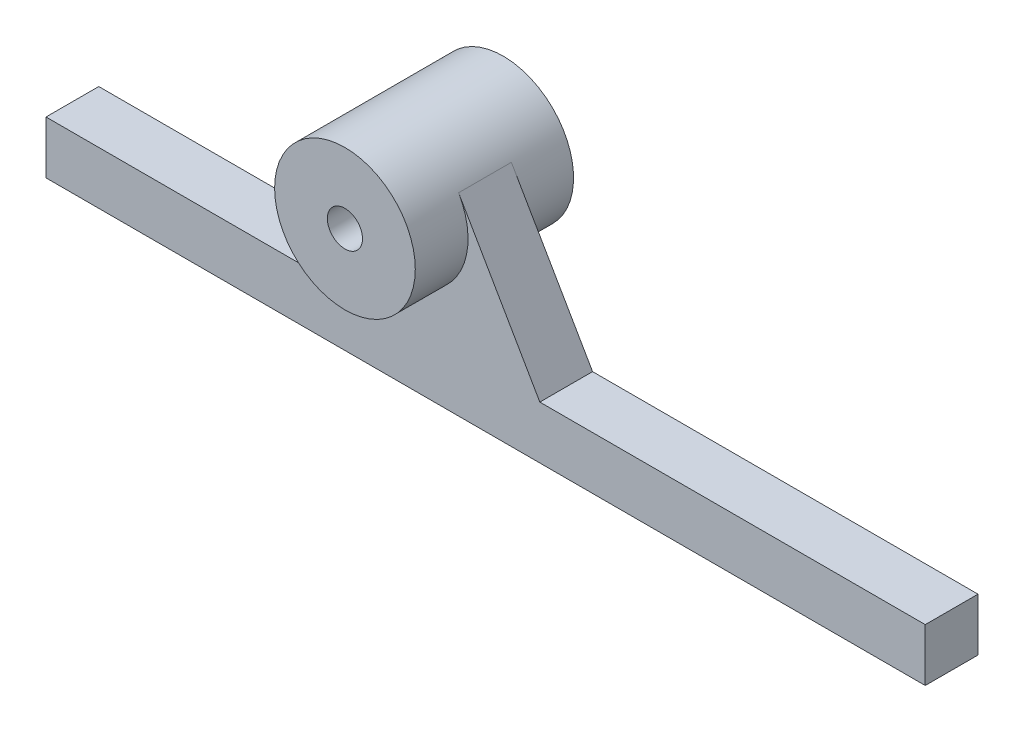
ISO-10303-21;
HEADER;
FILE_DESCRIPTION(('STEP AP214'),'2;1');
FILE_NAME('part.step','',(''),(''),'','','');
FILE_SCHEMA(('AUTOMOTIVE_DESIGN { 1 0 10303 214 1 1 1 1 }'));
ENDSEC;
DATA;
#1=APPLICATION_CONTEXT('core data for automotive mechanical design processes');
#2=APPLICATION_PROTOCOL_DEFINITION('international standard','automotive_design',2000,#1);
#3=PRODUCT_CONTEXT('',#1,'mechanical');
#4=PRODUCT('Part','Part','',(#3));
#5=PRODUCT_RELATED_PRODUCT_CATEGORY('part','',(#4));
#6=PRODUCT_DEFINITION_FORMATION('','',#4);
#7=PRODUCT_DEFINITION_CONTEXT('part definition',#1,'design');
#8=PRODUCT_DEFINITION('design','',#6,#7);
#9=PRODUCT_DEFINITION_SHAPE('','',#8);
#10=(LENGTH_UNIT() NAMED_UNIT(*) SI_UNIT(.MILLI.,.METRE.));
#11=(NAMED_UNIT(*) PLANE_ANGLE_UNIT() SI_UNIT($,.RADIAN.));
#12=(NAMED_UNIT(*) SI_UNIT($,.STERADIAN.) SOLID_ANGLE_UNIT());
#13=UNCERTAINTY_MEASURE_WITH_UNIT(LENGTH_MEASURE(1.E-05),#10,'distance_accuracy_value','');
#14=(GEOMETRIC_REPRESENTATION_CONTEXT(3) GLOBAL_UNCERTAINTY_ASSIGNED_CONTEXT((#13)) GLOBAL_UNIT_ASSIGNED_CONTEXT((#10,
#11,#12)) REPRESENTATION_CONTEXT('',''));
#15=CARTESIAN_POINT('',(0.,0.,0.));
#16=DIRECTION('',(0.,0.,1.));
#17=DIRECTION('',(1.,0.,0.));
#18=AXIS2_PLACEMENT_3D('',#15,#16,#17);
#19=CARTESIAN_POINT('',(0.,45.,15.));
#20=DIRECTION('',(0.,0.,1.));
#21=DIRECTION('',(1.,0.,0.));
#22=AXIS2_PLACEMENT_3D('',#19,#20,#21);
#23=PLANE('',#22);
#24=CARTESIAN_POINT('',(0.,45.,15.));
#25=DIRECTION('',(0.,0.,1.));
#26=DIRECTION('',(1.,0.,0.));
#27=AXIS2_PLACEMENT_3D('',#24,#25,#26);
#28=CIRCLE('',#27,20.);
#29=CARTESIAN_POINT('',(-19.6961550602442,48.4729635533385,15.));
#30=VERTEX_POINT('',#29);
#31=CARTESIAN_POINT('',(17.3205080756887,55.0000000000001,15.));
#32=VERTEX_POINT('',#31);
#33=EDGE_CURVE('E43',#30,#32,#28,.T.);
#34=ORIENTED_EDGE('',*,*,#33,.F.);
#35=DIRECTION('',(-0.173648177666927,-0.984807753012209,0.));
#36=VECTOR('',#35,1.);
#37=CARTESIAN_POINT('',(-19.6961550602442,48.4729635533385,15.));
#38=LINE('',#37,#36);
#39=CARTESIAN_POINT('',(-25.5983416589687,15.,15.));
#40=VERTEX_POINT('',#39);
#41=EDGE_CURVE('E109',#30,#40,#38,.T.);
#42=ORIENTED_EDGE('',*,*,#41,.T.);
#43=DIRECTION('',(-1.,0.,0.));
#44=VECTOR('',#43,1.);
#45=CARTESIAN_POINT('',(-25.5983416589687,15.,15.));
#46=LINE('',#45,#44);
#47=CARTESIAN_POINT('',(-100.,15.,15.));
#48=VERTEX_POINT('',#47);
#49=EDGE_CURVE('E52',#40,#48,#46,.T.);
#50=ORIENTED_EDGE('',*,*,#49,.T.);
#51=DIRECTION('',(0.,-1.,0.));
#52=VECTOR('',#51,1.);
#53=CARTESIAN_POINT('',(-100.,15.,15.));
#54=LINE('',#53,#52);
#55=CARTESIAN_POINT('',(-100.,0.,15.));
#56=VERTEX_POINT('',#55);
#57=EDGE_CURVE('E145',#48,#56,#54,.T.);
#58=ORIENTED_EDGE('',*,*,#57,.T.);
#59=DIRECTION('',(1.,0.,0.));
#60=VECTOR('',#59,1.);
#61=CARTESIAN_POINT('',(-100.,0.,15.));
#62=LINE('',#61,#60);
#63=CARTESIAN_POINT('',(150.,0.,15.));
#64=VERTEX_POINT('',#63);
#65=EDGE_CURVE('E94',#56,#64,#62,.T.);
#66=ORIENTED_EDGE('',*,*,#65,.T.);
#67=DIRECTION('',(0.,1.,0.));
#68=VECTOR('',#67,1.);
#69=CARTESIAN_POINT('',(150.,0.,15.));
#70=LINE('',#69,#68);
#71=CARTESIAN_POINT('',(150.,15.,15.));
#72=VERTEX_POINT('',#71);
#73=EDGE_CURVE('E174',#64,#72,#70,.T.);
#74=ORIENTED_EDGE('',*,*,#73,.T.);
#75=DIRECTION('',(-1.,0.,0.));
#76=VECTOR('',#75,1.);
#77=CARTESIAN_POINT('',(150.,15.,15.));
#78=LINE('',#77,#76);
#79=CARTESIAN_POINT('',(40.4145188432741,15.,15.));
#80=VERTEX_POINT('',#79);
#81=EDGE_CURVE('E126',#72,#80,#78,.T.);
#82=ORIENTED_EDGE('',*,*,#81,.T.);
#83=DIRECTION('',(-0.500000000000004,0.866025403784436,0.));
#84=VECTOR('',#83,1.);
#85=CARTESIAN_POINT('',(17.3205080756887,55.0000000000001,15.));
#86=LINE('',#85,#84);
#87=EDGE_CURVE('E111',#80,#32,#86,.T.);
#88=ORIENTED_EDGE('',*,*,#87,.T.);
#89=EDGE_LOOP('',(#34,#42,#50,#58,#66,#74,#82,#88));
#90=FACE_BOUND('',#89,.T.);
#91=ADVANCED_FACE('F33',(#90),#23,.T.);
#92=CARTESIAN_POINT('',(0.,45.,0.));
#93=DIRECTION('',(0.,0.,1.));
#94=DIRECTION('',(1.,0.,0.));
#95=AXIS2_PLACEMENT_3D('',#92,#93,#94);
#96=PLANE('',#95);
#97=CARTESIAN_POINT('',(0.,45.,0.));
#98=DIRECTION('',(0.,0.,-1.));
#99=DIRECTION('',(-1.,0.,0.));
#100=AXIS2_PLACEMENT_3D('',#97,#98,#99);
#101=CIRCLE('',#100,20.);
#102=CARTESIAN_POINT('',(17.3205080756887,55.0000000000001,0.));
#103=VERTEX_POINT('',#102);
#104=CARTESIAN_POINT('',(-19.6961550602442,48.4729635533385,0.));
#105=VERTEX_POINT('',#104);
#106=EDGE_CURVE('E11',#103,#105,#101,.T.);
#107=ORIENTED_EDGE('',*,*,#106,.F.);
#108=DIRECTION('',(-0.500000000000004,0.866025403784436,0.));
#109=VECTOR('',#108,1.);
#110=CARTESIAN_POINT('',(17.3205080756887,55.0000000000001,0.));
#111=LINE('',#110,#109);
#112=CARTESIAN_POINT('',(40.4145188432741,15.,0.));
#113=VERTEX_POINT('',#112);
#114=EDGE_CURVE('E140',#113,#103,#111,.T.);
#115=ORIENTED_EDGE('',*,*,#114,.F.);
#116=DIRECTION('',(-1.,0.,0.));
#117=VECTOR('',#116,1.);
#118=CARTESIAN_POINT('',(150.,15.,0.));
#119=LINE('',#118,#117);
#120=CARTESIAN_POINT('',(150.,15.,0.));
#121=VERTEX_POINT('',#120);
#122=EDGE_CURVE('E138',#121,#113,#119,.T.);
#123=ORIENTED_EDGE('',*,*,#122,.F.);
#124=DIRECTION('',(0.,1.,0.));
#125=VECTOR('',#124,1.);
#126=CARTESIAN_POINT('',(150.,0.,0.));
#127=LINE('',#126,#125);
#128=CARTESIAN_POINT('',(150.,0.,0.));
#129=VERTEX_POINT('',#128);
#130=EDGE_CURVE('E136',#129,#121,#127,.T.);
#131=ORIENTED_EDGE('',*,*,#130,.F.);
#132=DIRECTION('',(1.,0.,0.));
#133=VECTOR('',#132,1.);
#134=CARTESIAN_POINT('',(-100.,0.,0.));
#135=LINE('',#134,#133);
#136=CARTESIAN_POINT('',(-100.,0.,0.));
#137=VERTEX_POINT('',#136);
#138=EDGE_CURVE('E133',#137,#129,#135,.T.);
#139=ORIENTED_EDGE('',*,*,#138,.F.);
#140=DIRECTION('',(0.,-1.,0.));
#141=VECTOR('',#140,1.);
#142=CARTESIAN_POINT('',(-100.,15.,0.));
#143=LINE('',#142,#141);
#144=CARTESIAN_POINT('',(-100.,15.,0.));
#145=VERTEX_POINT('',#144);
#146=EDGE_CURVE('E130',#145,#137,#143,.T.);
#147=ORIENTED_EDGE('',*,*,#146,.F.);
#148=DIRECTION('',(-1.,0.,0.));
#149=VECTOR('',#148,1.);
#150=CARTESIAN_POINT('',(-25.5983416589687,15.,0.));
#151=LINE('',#150,#149);
#152=CARTESIAN_POINT('',(-25.5983416589687,15.,0.));
#153=VERTEX_POINT('',#152);
#154=EDGE_CURVE('E85',#153,#145,#151,.T.);
#155=ORIENTED_EDGE('',*,*,#154,.F.);
#156=DIRECTION('',(-0.173648177666927,-0.984807753012209,0.));
#157=VECTOR('',#156,1.);
#158=CARTESIAN_POINT('',(-19.6961550602442,48.4729635533385,0.));
#159=LINE('',#158,#157);
#160=EDGE_CURVE('E79',#105,#153,#159,.T.);
#161=ORIENTED_EDGE('',*,*,#160,.F.);
#162=EDGE_LOOP('',(#107,#115,#123,#131,#139,#147,#155,#161));
#163=FACE_BOUND('',#162,.T.);
#164=ADVANCED_FACE('F165',(#163),#96,.F.);
#165=CARTESIAN_POINT('',(-100.,15.,15.));
#166=DIRECTION('',(1.,0.,0.));
#167=DIRECTION('',(0.,0.,-1.));
#168=AXIS2_PLACEMENT_3D('',#165,#166,#167);
#169=PLANE('',#168);
#170=ORIENTED_EDGE('',*,*,#146,.T.);
#171=DIRECTION('',(0.,0.,-1.));
#172=VECTOR('',#171,1.);
#173=CARTESIAN_POINT('',(-100.,0.,15.));
#174=LINE('',#173,#172);
#175=EDGE_CURVE('E37',#56,#137,#174,.T.);
#176=ORIENTED_EDGE('',*,*,#175,.F.);
#177=ORIENTED_EDGE('',*,*,#57,.F.);
#178=DIRECTION('',(0.,0.,-1.));
#179=VECTOR('',#178,1.);
#180=CARTESIAN_POINT('',(-100.,15.,15.));
#181=LINE('',#180,#179);
#182=EDGE_CURVE('E124',#48,#145,#181,.T.);
#183=ORIENTED_EDGE('',*,*,#182,.T.);
#184=EDGE_LOOP('',(#170,#176,#177,#183));
#185=FACE_BOUND('',#184,.T.);
#186=ADVANCED_FACE('F35',(#185),#169,.F.);
#187=CARTESIAN_POINT('',(-100.,0.,15.));
#188=DIRECTION('',(0.,1.,0.));
#189=DIRECTION('',(0.,0.,1.));
#190=AXIS2_PLACEMENT_3D('',#187,#188,#189);
#191=PLANE('',#190);
#192=ORIENTED_EDGE('',*,*,#138,.T.);
#193=DIRECTION('',(0.,0.,-1.));
#194=VECTOR('',#193,1.);
#195=CARTESIAN_POINT('',(150.,0.,15.));
#196=LINE('',#195,#194);
#197=EDGE_CURVE('E154',#64,#129,#196,.T.);
#198=ORIENTED_EDGE('',*,*,#197,.F.);
#199=ORIENTED_EDGE('',*,*,#65,.F.);
#200=ORIENTED_EDGE('',*,*,#175,.T.);
#201=EDGE_LOOP('',(#192,#198,#199,#200));
#202=FACE_BOUND('',#201,.T.);
#203=ADVANCED_FACE('F160',(#202),#191,.F.);
#204=CARTESIAN_POINT('',(150.,0.,15.));
#205=DIRECTION('',(-1.,0.,0.));
#206=DIRECTION('',(0.,0.,1.));
#207=AXIS2_PLACEMENT_3D('',#204,#205,#206);
#208=PLANE('',#207);
#209=ORIENTED_EDGE('',*,*,#130,.T.);
#210=DIRECTION('',(0.,0.,-1.));
#211=VECTOR('',#210,1.);
#212=CARTESIAN_POINT('',(150.,15.,15.));
#213=LINE('',#212,#211);
#214=EDGE_CURVE('E152',#72,#121,#213,.T.);
#215=ORIENTED_EDGE('',*,*,#214,.F.);
#216=ORIENTED_EDGE('',*,*,#73,.F.);
#217=ORIENTED_EDGE('',*,*,#197,.T.);
#218=EDGE_LOOP('',(#209,#215,#216,#217));
#219=FACE_BOUND('',#218,.T.);
#220=ADVANCED_FACE('F169',(#219),#208,.F.);
#221=CARTESIAN_POINT('',(150.,15.,15.));
#222=DIRECTION('',(0.,-1.,0.));
#223=DIRECTION('',(1.,0.,0.));
#224=AXIS2_PLACEMENT_3D('',#221,#222,#223);
#225=PLANE('',#224);
#226=ORIENTED_EDGE('',*,*,#122,.T.);
#227=DIRECTION('',(0.,0.,-1.));
#228=VECTOR('',#227,1.);
#229=CARTESIAN_POINT('',(40.4145188432741,15.,15.));
#230=LINE('',#229,#228);
#231=EDGE_CURVE('E149',#80,#113,#230,.T.);
#232=ORIENTED_EDGE('',*,*,#231,.F.);
#233=ORIENTED_EDGE('',*,*,#81,.F.);
#234=ORIENTED_EDGE('',*,*,#214,.T.);
#235=EDGE_LOOP('',(#226,#232,#233,#234));
#236=FACE_BOUND('',#235,.T.);
#237=ADVANCED_FACE('F172',(#236),#225,.F.);
#238=CARTESIAN_POINT('',(17.3205080756887,55.0000000000001,15.));
#239=DIRECTION('',(-0.866025403784436,-0.500000000000004,0.));
#240=DIRECTION('',(0.500000000000004,-0.866025403784436,0.));
#241=AXIS2_PLACEMENT_3D('',#238,#239,#240);
#242=PLANE('',#241);
#243=ORIENTED_EDGE('',*,*,#114,.T.);
#244=DIRECTION('',(0.,0.,-1.));
#245=VECTOR('',#244,1.);
#246=CARTESIAN_POINT('',(17.3205080756887,55.0000000000001,15.));
#247=LINE('',#246,#245);
#248=EDGE_CURVE('E119',#32,#103,#247,.T.);
#249=ORIENTED_EDGE('',*,*,#248,.F.);
#250=ORIENTED_EDGE('',*,*,#87,.F.);
#251=ORIENTED_EDGE('',*,*,#231,.T.);
#252=EDGE_LOOP('',(#243,#249,#250,#251));
#253=FACE_BOUND('',#252,.T.);
#254=ADVANCED_FACE('F218',(#253),#242,.F.);
#255=CARTESIAN_POINT('',(0.,45.,15.));
#256=DIRECTION('',(0.,0.,-1.));
#257=DIRECTION('',(-1.,0.,0.));
#258=AXIS2_PLACEMENT_3D('',#255,#256,#257);
#259=CYLINDRICAL_SURFACE('',#258,20.);
#260=ORIENTED_EDGE('',*,*,#248,.T.);
#261=ORIENTED_EDGE('',*,*,#106,.T.);
#262=DIRECTION('',(0.,0.,-1.));
#263=VECTOR('',#262,1.);
#264=CARTESIAN_POINT('',(-19.6961550602442,48.4729635533385,15.));
#265=LINE('',#264,#263);
#266=EDGE_CURVE('E115',#30,#105,#265,.T.);
#267=ORIENTED_EDGE('',*,*,#266,.F.);
#268=ORIENTED_EDGE('',*,*,#33,.T.);
#269=EDGE_LOOP('',(#260,#261,#267,#268));
#270=FACE_BOUND('',#269,.T.);
#271=CARTESIAN_POINT('',(0.,45.,30.));
#272=DIRECTION('',(0.,0.,1.));
#273=DIRECTION('',(1.,0.,0.));
#274=AXIS2_PLACEMENT_3D('',#271,#272,#273);
#275=CIRCLE('',#274,20.);
#276=CARTESIAN_POINT('',(20.,45.,30.));
#277=VERTEX_POINT('',#276);
#278=EDGE_CURVE('E134',#277,#277,#275,.T.);
#279=ORIENTED_EDGE('',*,*,#278,.F.);
#280=EDGE_LOOP('',(#279));
#281=FACE_BOUND('',#280,.T.);
#282=CARTESIAN_POINT('',(0.,45.,-15.));
#283=DIRECTION('',(0.,0.,-1.));
#284=DIRECTION('',(-1.,0.,0.));
#285=AXIS2_PLACEMENT_3D('',#282,#283,#284);
#286=CIRCLE('',#285,20.);
#287=CARTESIAN_POINT('',(-20.,45.,-15.));
#288=VERTEX_POINT('',#287);
#289=EDGE_CURVE('E183',#288,#288,#286,.T.);
#290=ORIENTED_EDGE('',*,*,#289,.F.);
#291=EDGE_LOOP('',(#290));
#292=FACE_BOUND('',#291,.T.);
#293=ADVANCED_FACE('F116',(#270,#281,#292),#259,.T.);
#294=CARTESIAN_POINT('',(-19.6961550602442,48.4729635533385,15.));
#295=DIRECTION('',(0.984807753012209,-0.173648177666927,0.));
#296=DIRECTION('',(0.173648177666927,0.984807753012209,0.));
#297=AXIS2_PLACEMENT_3D('',#294,#295,#296);
#298=PLANE('',#297);
#299=ORIENTED_EDGE('',*,*,#160,.T.);
#300=DIRECTION('',(0.,0.,-1.));
#301=VECTOR('',#300,1.);
#302=CARTESIAN_POINT('',(-25.5983416589687,15.,15.));
#303=LINE('',#302,#301);
#304=EDGE_CURVE('E120',#40,#153,#303,.T.);
#305=ORIENTED_EDGE('',*,*,#304,.F.);
#306=ORIENTED_EDGE('',*,*,#41,.F.);
#307=ORIENTED_EDGE('',*,*,#266,.T.);
#308=EDGE_LOOP('',(#299,#305,#306,#307));
#309=FACE_BOUND('',#308,.T.);
#310=ADVANCED_FACE('F122',(#309),#298,.F.);
#311=CARTESIAN_POINT('',(-25.5983416589687,15.,15.));
#312=DIRECTION('',(0.,-1.,0.));
#313=DIRECTION('',(1.,0.,0.));
#314=AXIS2_PLACEMENT_3D('',#311,#312,#313);
#315=PLANE('',#314);
#316=ORIENTED_EDGE('',*,*,#154,.T.);
#317=ORIENTED_EDGE('',*,*,#182,.F.);
#318=ORIENTED_EDGE('',*,*,#49,.F.);
#319=ORIENTED_EDGE('',*,*,#304,.T.);
#320=EDGE_LOOP('',(#316,#317,#318,#319));
#321=FACE_BOUND('',#320,.T.);
#322=ADVANCED_FACE('F211',(#321),#315,.F.);
#323=CARTESIAN_POINT('',(0.,45.,15.));
#324=DIRECTION('',(0.,0.,-1.));
#325=DIRECTION('',(-1.,0.,0.));
#326=AXIS2_PLACEMENT_3D('',#323,#324,#325);
#327=CYLINDRICAL_SURFACE('',#326,5.);
#328=CARTESIAN_POINT('',(0.,45.,30.));
#329=DIRECTION('',(0.,0.,1.));
#330=DIRECTION('',(1.,0.,0.));
#331=AXIS2_PLACEMENT_3D('',#328,#329,#330);
#332=CIRCLE('',#331,5.);
#333=CARTESIAN_POINT('',(5.,45.,30.));
#334=VERTEX_POINT('',#333);
#335=EDGE_CURVE('E181',#334,#334,#332,.T.);
#336=ORIENTED_EDGE('',*,*,#335,.T.);
#337=EDGE_LOOP('',(#336));
#338=FACE_BOUND('',#337,.T.);
#339=CARTESIAN_POINT('',(0.,45.,-15.));
#340=DIRECTION('',(0.,0.,-1.));
#341=DIRECTION('',(-1.,0.,0.));
#342=AXIS2_PLACEMENT_3D('',#339,#340,#341);
#343=CIRCLE('',#342,5.);
#344=CARTESIAN_POINT('',(-5.,45.,-15.));
#345=VERTEX_POINT('',#344);
#346=EDGE_CURVE('E187',#345,#345,#343,.T.);
#347=ORIENTED_EDGE('',*,*,#346,.T.);
#348=EDGE_LOOP('',(#347));
#349=FACE_BOUND('',#348,.T.);
#350=ADVANCED_FACE('F191',(#338,#349),#327,.F.);
#351=CARTESIAN_POINT('',(0.,45.,30.));
#352=DIRECTION('',(0.,0.,1.));
#353=DIRECTION('',(1.,0.,0.));
#354=AXIS2_PLACEMENT_3D('',#351,#352,#353);
#355=PLANE('',#354);
#356=ORIENTED_EDGE('',*,*,#278,.T.);
#357=EDGE_LOOP('',(#356));
#358=FACE_BOUND('',#357,.T.);
#359=ORIENTED_EDGE('',*,*,#335,.F.);
#360=EDGE_LOOP('',(#359));
#361=FACE_BOUND('',#360,.T.);
#362=ADVANCED_FACE('F195',(#358,#361),#355,.T.);
#363=CARTESIAN_POINT('',(0.,45.,-15.));
#364=DIRECTION('',(0.,0.,-1.));
#365=DIRECTION('',(-1.,0.,0.));
#366=AXIS2_PLACEMENT_3D('',#363,#364,#365);
#367=PLANE('',#366);
#368=ORIENTED_EDGE('',*,*,#289,.T.);
#369=EDGE_LOOP('',(#368));
#370=FACE_BOUND('',#369,.T.);
#371=ORIENTED_EDGE('',*,*,#346,.F.);
#372=EDGE_LOOP('',(#371));
#373=FACE_BOUND('',#372,.T.);
#374=ADVANCED_FACE('F193',(#370,#373),#367,.T.);
#375=CLOSED_SHELL('',(#91,#164,#186,#203,#220,#237,#254,#293,#310,#322,#350,#362,#374));
#376=MANIFOLD_SOLID_BREP('B2',#375);
#377=ADVANCED_BREP_SHAPE_REPRESENTATION('',(#18,#376),#14);
#378=SHAPE_DEFINITION_REPRESENTATION(#9,#377);
ENDSEC;
END-ISO-10303-21;
